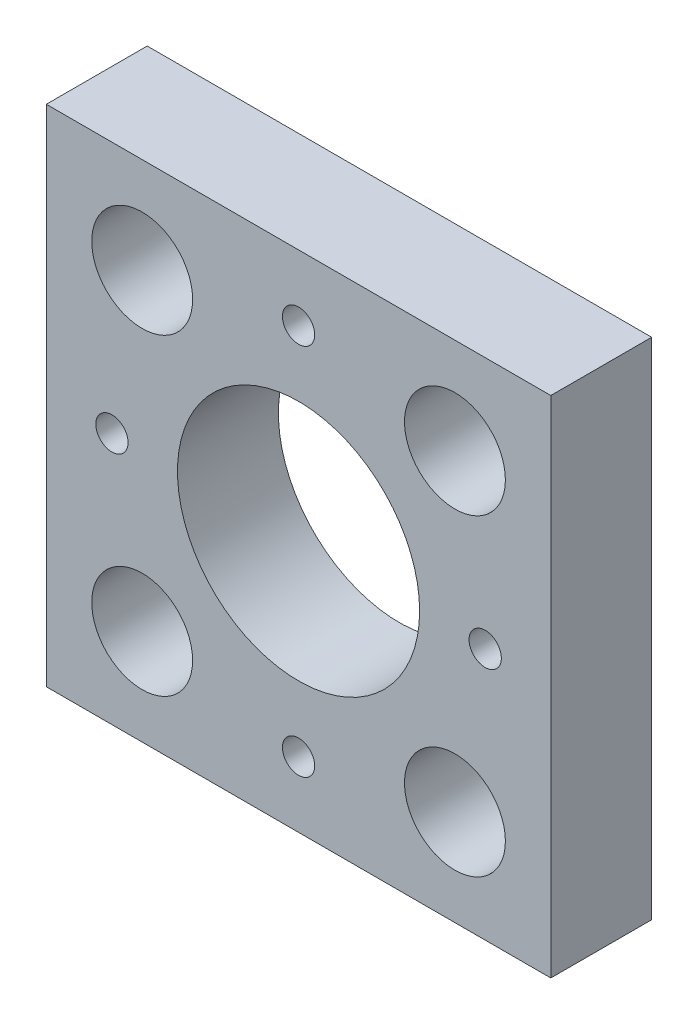
ISO-10303-21;
HEADER;
FILE_DESCRIPTION(('STEP AP214'),'2;1');
FILE_NAME('part.step','',(''),(''),'','','');
FILE_SCHEMA(('AUTOMOTIVE_DESIGN { 1 0 10303 214 1 1 1 1 }'));
ENDSEC;
DATA;
#1=APPLICATION_CONTEXT('core data for automotive mechanical design processes');
#2=APPLICATION_PROTOCOL_DEFINITION('international standard','automotive_design',2000,#1);
#3=PRODUCT_CONTEXT('',#1,'mechanical');
#4=PRODUCT('Part','Part','',(#3));
#5=PRODUCT_RELATED_PRODUCT_CATEGORY('part','',(#4));
#6=PRODUCT_DEFINITION_FORMATION('','',#4);
#7=PRODUCT_DEFINITION_CONTEXT('part definition',#1,'design');
#8=PRODUCT_DEFINITION('design','',#6,#7);
#9=PRODUCT_DEFINITION_SHAPE('','',#8);
#10=(LENGTH_UNIT() NAMED_UNIT(*) SI_UNIT(.MILLI.,.METRE.));
#11=(NAMED_UNIT(*) PLANE_ANGLE_UNIT() SI_UNIT($,.RADIAN.));
#12=(NAMED_UNIT(*) SI_UNIT($,.STERADIAN.) SOLID_ANGLE_UNIT());
#13=UNCERTAINTY_MEASURE_WITH_UNIT(LENGTH_MEASURE(1.E-05),#10,'distance_accuracy_value','');
#14=(GEOMETRIC_REPRESENTATION_CONTEXT(3) GLOBAL_UNCERTAINTY_ASSIGNED_CONTEXT((#13)) GLOBAL_UNIT_ASSIGNED_CONTEXT((#10,
#11,#12)) REPRESENTATION_CONTEXT('',''));
#15=CARTESIAN_POINT('',(0.,0.,0.));
#16=DIRECTION('',(0.,0.,1.));
#17=DIRECTION('',(1.,0.,0.));
#18=AXIS2_PLACEMENT_3D('',#15,#16,#17);
#19=CARTESIAN_POINT('',(25.,-25.,10.));
#20=DIRECTION('',(-1.,0.,0.));
#21=DIRECTION('',(0.,0.,1.));
#22=AXIS2_PLACEMENT_3D('',#19,#20,#21);
#23=PLANE('',#22);
#24=DIRECTION('',(0.,1.,0.));
#25=VECTOR('',#24,1.);
#26=CARTESIAN_POINT('',(25.,-25.,0.));
#27=LINE('',#26,#25);
#28=CARTESIAN_POINT('',(25.,-25.,0.));
#29=VERTEX_POINT('',#28);
#30=CARTESIAN_POINT('',(25.,25.,0.));
#31=VERTEX_POINT('',#30);
#32=EDGE_CURVE('E102',#29,#31,#27,.T.);
#33=ORIENTED_EDGE('',*,*,#32,.T.);
#34=DIRECTION('',(0.,0.,-1.));
#35=VECTOR('',#34,1.);
#36=CARTESIAN_POINT('',(25.,25.,10.));
#37=LINE('',#36,#35);
#38=CARTESIAN_POINT('',(25.,25.,10.));
#39=VERTEX_POINT('',#38);
#40=EDGE_CURVE('E11',#39,#31,#37,.T.);
#41=ORIENTED_EDGE('',*,*,#40,.F.);
#42=DIRECTION('',(0.,1.,0.));
#43=VECTOR('',#42,1.);
#44=CARTESIAN_POINT('',(25.,-25.,10.));
#45=LINE('',#44,#43);
#46=CARTESIAN_POINT('',(25.,-25.,10.));
#47=VERTEX_POINT('',#46);
#48=EDGE_CURVE('E90',#47,#39,#45,.T.);
#49=ORIENTED_EDGE('',*,*,#48,.F.);
#50=DIRECTION('',(0.,0.,-1.));
#51=VECTOR('',#50,1.);
#52=CARTESIAN_POINT('',(25.,-25.,10.));
#53=LINE('',#52,#51);
#54=EDGE_CURVE('E98',#47,#29,#53,.T.);
#55=ORIENTED_EDGE('',*,*,#54,.T.);
#56=EDGE_LOOP('',(#33,#41,#49,#55));
#57=FACE_BOUND('',#56,.T.);
#58=ADVANCED_FACE('F39',(#57),#23,.F.);
#59=CARTESIAN_POINT('',(-25.,25.,10.));
#60=DIRECTION('',(0.,-1.,0.));
#61=DIRECTION('',(0.,0.,-1.));
#62=AXIS2_PLACEMENT_3D('',#59,#60,#61);
#63=PLANE('',#62);
#64=DIRECTION('',(-1.,0.,0.));
#65=VECTOR('',#64,1.);
#66=CARTESIAN_POINT('',(-25.,25.,0.));
#67=LINE('',#66,#65);
#68=CARTESIAN_POINT('',(-25.,25.,0.));
#69=VERTEX_POINT('',#68);
#70=EDGE_CURVE('E94',#31,#69,#67,.T.);
#71=ORIENTED_EDGE('',*,*,#70,.T.);
#72=DIRECTION('',(0.,0.,-1.));
#73=VECTOR('',#72,1.);
#74=CARTESIAN_POINT('',(-25.,25.,10.));
#75=LINE('',#74,#73);
#76=CARTESIAN_POINT('',(-25.,25.,10.));
#77=VERTEX_POINT('',#76);
#78=EDGE_CURVE('E47',#77,#69,#75,.T.);
#79=ORIENTED_EDGE('',*,*,#78,.F.);
#80=DIRECTION('',(-1.,0.,0.));
#81=VECTOR('',#80,1.);
#82=CARTESIAN_POINT('',(-25.,25.,10.));
#83=LINE('',#82,#81);
#84=EDGE_CURVE('E85',#39,#77,#83,.T.);
#85=ORIENTED_EDGE('',*,*,#84,.F.);
#86=ORIENTED_EDGE('',*,*,#40,.T.);
#87=EDGE_LOOP('',(#71,#79,#85,#86));
#88=FACE_BOUND('',#87,.T.);
#89=ADVANCED_FACE('F93',(#88),#63,.F.);
#90=CARTESIAN_POINT('',(-25.,-25.,10.));
#91=DIRECTION('',(1.,0.,0.));
#92=DIRECTION('',(0.,0.,-1.));
#93=AXIS2_PLACEMENT_3D('',#90,#91,#92);
#94=PLANE('',#93);
#95=DIRECTION('',(0.,-1.,0.));
#96=VECTOR('',#95,1.);
#97=CARTESIAN_POINT('',(-25.,-25.,0.));
#98=LINE('',#97,#96);
#99=CARTESIAN_POINT('',(-25.,-25.,0.));
#100=VERTEX_POINT('',#99);
#101=EDGE_CURVE('E72',#69,#100,#98,.T.);
#102=ORIENTED_EDGE('',*,*,#101,.T.);
#103=DIRECTION('',(0.,0.,-1.));
#104=VECTOR('',#103,1.);
#105=CARTESIAN_POINT('',(-25.,-25.,10.));
#106=LINE('',#105,#104);
#107=CARTESIAN_POINT('',(-25.,-25.,10.));
#108=VERTEX_POINT('',#107);
#109=EDGE_CURVE('E95',#108,#100,#106,.T.);
#110=ORIENTED_EDGE('',*,*,#109,.F.);
#111=DIRECTION('',(0.,-1.,0.));
#112=VECTOR('',#111,1.);
#113=CARTESIAN_POINT('',(-25.,-25.,10.));
#114=LINE('',#113,#112);
#115=EDGE_CURVE('E88',#77,#108,#114,.T.);
#116=ORIENTED_EDGE('',*,*,#115,.F.);
#117=ORIENTED_EDGE('',*,*,#78,.T.);
#118=EDGE_LOOP('',(#102,#110,#116,#117));
#119=FACE_BOUND('',#118,.T.);
#120=ADVANCED_FACE('F96',(#119),#94,.F.);
#121=CARTESIAN_POINT('',(-25.,-25.,10.));
#122=DIRECTION('',(0.,1.,0.));
#123=DIRECTION('',(0.,0.,1.));
#124=AXIS2_PLACEMENT_3D('',#121,#122,#123);
#125=PLANE('',#124);
#126=DIRECTION('',(1.,0.,0.));
#127=VECTOR('',#126,1.);
#128=CARTESIAN_POINT('',(-25.,-25.,0.));
#129=LINE('',#128,#127);
#130=EDGE_CURVE('E78',#100,#29,#129,.T.);
#131=ORIENTED_EDGE('',*,*,#130,.T.);
#132=ORIENTED_EDGE('',*,*,#54,.F.);
#133=DIRECTION('',(1.,0.,0.));
#134=VECTOR('',#133,1.);
#135=CARTESIAN_POINT('',(-25.,-25.,10.));
#136=LINE('',#135,#134);
#137=EDGE_CURVE('E55',#108,#47,#136,.T.);
#138=ORIENTED_EDGE('',*,*,#137,.F.);
#139=ORIENTED_EDGE('',*,*,#109,.T.);
#140=EDGE_LOOP('',(#131,#132,#138,#139));
#141=FACE_BOUND('',#140,.T.);
#142=ADVANCED_FACE('F110',(#141),#125,.F.);
#143=CARTESIAN_POINT('',(0.,0.,10.));
#144=DIRECTION('',(0.,0.,-1.));
#145=DIRECTION('',(-1.,0.,0.));
#146=AXIS2_PLACEMENT_3D('',#143,#144,#145);
#147=PLANE('',#146);
#148=CARTESIAN_POINT('',(-15.5,15.5,10.));
#149=DIRECTION('',(0.,0.,1.));
#150=DIRECTION('',(1.,0.,0.));
#151=AXIS2_PLACEMENT_3D('',#148,#149,#150);
#152=CIRCLE('',#151,5.00000000000001);
#153=CARTESIAN_POINT('',(-10.5,15.5,10.));
#154=VERTEX_POINT('',#153);
#155=EDGE_CURVE('E166',#154,#154,#152,.T.);
#156=ORIENTED_EDGE('',*,*,#155,.F.);
#157=EDGE_LOOP('',(#156));
#158=FACE_BOUND('',#157,.T.);
#159=CARTESIAN_POINT('',(15.5,15.5,10.));
#160=DIRECTION('',(0.,0.,1.));
#161=DIRECTION('',(1.,0.,0.));
#162=AXIS2_PLACEMENT_3D('',#159,#160,#161);
#163=CIRCLE('',#162,5.00000000000002);
#164=CARTESIAN_POINT('',(20.5,15.5,10.));
#165=VERTEX_POINT('',#164);
#166=EDGE_CURVE('E160',#165,#165,#163,.T.);
#167=ORIENTED_EDGE('',*,*,#166,.F.);
#168=EDGE_LOOP('',(#167));
#169=FACE_BOUND('',#168,.T.);
#170=CARTESIAN_POINT('',(15.5,-15.5,10.));
#171=DIRECTION('',(0.,0.,1.));
#172=DIRECTION('',(1.,0.,0.));
#173=AXIS2_PLACEMENT_3D('',#170,#171,#172);
#174=CIRCLE('',#173,5.00000000000002);
#175=CARTESIAN_POINT('',(20.5,-15.5,10.));
#176=VERTEX_POINT('',#175);
#177=EDGE_CURVE('E154',#176,#176,#174,.T.);
#178=ORIENTED_EDGE('',*,*,#177,.F.);
#179=EDGE_LOOP('',(#178));
#180=FACE_BOUND('',#179,.T.);
#181=CARTESIAN_POINT('',(-15.5,-15.5,10.));
#182=DIRECTION('',(0.,0.,1.));
#183=DIRECTION('',(1.,0.,0.));
#184=AXIS2_PLACEMENT_3D('',#181,#182,#183);
#185=CIRCLE('',#184,5.00000000000001);
#186=CARTESIAN_POINT('',(-10.5,-15.5,10.));
#187=VERTEX_POINT('',#186);
#188=EDGE_CURVE('E148',#187,#187,#185,.T.);
#189=ORIENTED_EDGE('',*,*,#188,.F.);
#190=EDGE_LOOP('',(#189));
#191=FACE_BOUND('',#190,.T.);
#192=CARTESIAN_POINT('',(0.,18.5,10.));
#193=DIRECTION('',(0.,0.,1.));
#194=DIRECTION('',(1.,0.,0.));
#195=AXIS2_PLACEMENT_3D('',#192,#193,#194);
#196=CIRCLE('',#195,1.60000000000001);
#197=CARTESIAN_POINT('',(1.60000000000002,18.5,10.));
#198=VERTEX_POINT('',#197);
#199=EDGE_CURVE('E142',#198,#198,#196,.T.);
#200=ORIENTED_EDGE('',*,*,#199,.F.);
#201=EDGE_LOOP('',(#200));
#202=FACE_BOUND('',#201,.T.);
#203=CARTESIAN_POINT('',(18.5,0.,10.));
#204=DIRECTION('',(0.,0.,1.));
#205=DIRECTION('',(1.,0.,0.));
#206=AXIS2_PLACEMENT_3D('',#203,#204,#205);
#207=CIRCLE('',#206,1.60000000000001);
#208=CARTESIAN_POINT('',(20.1,0.,10.));
#209=VERTEX_POINT('',#208);
#210=EDGE_CURVE('E136',#209,#209,#207,.T.);
#211=ORIENTED_EDGE('',*,*,#210,.F.);
#212=EDGE_LOOP('',(#211));
#213=FACE_BOUND('',#212,.T.);
#214=CARTESIAN_POINT('',(0.,-18.5,10.));
#215=DIRECTION('',(0.,0.,1.));
#216=DIRECTION('',(1.,0.,0.));
#217=AXIS2_PLACEMENT_3D('',#214,#215,#216);
#218=CIRCLE('',#217,1.60000000000001);
#219=CARTESIAN_POINT('',(1.60000000000002,-18.5,10.));
#220=VERTEX_POINT('',#219);
#221=EDGE_CURVE('E130',#220,#220,#218,.T.);
#222=ORIENTED_EDGE('',*,*,#221,.F.);
#223=EDGE_LOOP('',(#222));
#224=FACE_BOUND('',#223,.T.);
#225=CARTESIAN_POINT('',(-18.5,0.,10.));
#226=DIRECTION('',(0.,0.,1.));
#227=DIRECTION('',(1.,0.,0.));
#228=AXIS2_PLACEMENT_3D('',#225,#226,#227);
#229=CIRCLE('',#228,1.60000000000001);
#230=CARTESIAN_POINT('',(-16.9,0.,10.));
#231=VERTEX_POINT('',#230);
#232=EDGE_CURVE('E124',#231,#231,#229,.T.);
#233=ORIENTED_EDGE('',*,*,#232,.F.);
#234=EDGE_LOOP('',(#233));
#235=FACE_BOUND('',#234,.T.);
#236=CARTESIAN_POINT('',(0.,0.,10.));
#237=DIRECTION('',(0.,0.,1.));
#238=DIRECTION('',(1.,0.,0.));
#239=AXIS2_PLACEMENT_3D('',#236,#237,#238);
#240=CIRCLE('',#239,12.);
#241=CARTESIAN_POINT('',(12.,0.,10.));
#242=VERTEX_POINT('',#241);
#243=EDGE_CURVE('E118',#242,#242,#240,.T.);
#244=ORIENTED_EDGE('',*,*,#243,.F.);
#245=EDGE_LOOP('',(#244));
#246=FACE_BOUND('',#245,.T.);
#247=ORIENTED_EDGE('',*,*,#48,.T.);
#248=ORIENTED_EDGE('',*,*,#84,.T.);
#249=ORIENTED_EDGE('',*,*,#115,.T.);
#250=ORIENTED_EDGE('',*,*,#137,.T.);
#251=EDGE_LOOP('',(#247,#248,#249,#250));
#252=FACE_BOUND('',#251,.T.);
#253=ADVANCED_FACE('F86',(#158,#169,#180,#191,#202,#213,#224,#235,#246,#252),#147,.F.);
#254=CARTESIAN_POINT('',(0.,0.,0.));
#255=DIRECTION('',(0.,0.,-1.));
#256=DIRECTION('',(-1.,0.,0.));
#257=AXIS2_PLACEMENT_3D('',#254,#255,#256);
#258=PLANE('',#257);
#259=CARTESIAN_POINT('',(-15.5,15.5,0.));
#260=DIRECTION('',(0.,0.,1.));
#261=DIRECTION('',(1.,0.,0.));
#262=AXIS2_PLACEMENT_3D('',#259,#260,#261);
#263=CIRCLE('',#262,5.00000000000001);
#264=CARTESIAN_POINT('',(-10.5,15.5,0.));
#265=VERTEX_POINT('',#264);
#266=EDGE_CURVE('E163',#265,#265,#263,.T.);
#267=ORIENTED_EDGE('',*,*,#266,.T.);
#268=EDGE_LOOP('',(#267));
#269=FACE_BOUND('',#268,.T.);
#270=CARTESIAN_POINT('',(15.5,15.5,0.));
#271=DIRECTION('',(0.,0.,1.));
#272=DIRECTION('',(1.,0.,0.));
#273=AXIS2_PLACEMENT_3D('',#270,#271,#272);
#274=CIRCLE('',#273,5.00000000000002);
#275=CARTESIAN_POINT('',(20.5,15.5,0.));
#276=VERTEX_POINT('',#275);
#277=EDGE_CURVE('E157',#276,#276,#274,.T.);
#278=ORIENTED_EDGE('',*,*,#277,.T.);
#279=EDGE_LOOP('',(#278));
#280=FACE_BOUND('',#279,.T.);
#281=CARTESIAN_POINT('',(15.5,-15.5,0.));
#282=DIRECTION('',(0.,0.,1.));
#283=DIRECTION('',(1.,0.,0.));
#284=AXIS2_PLACEMENT_3D('',#281,#282,#283);
#285=CIRCLE('',#284,5.00000000000002);
#286=CARTESIAN_POINT('',(20.5,-15.5,0.));
#287=VERTEX_POINT('',#286);
#288=EDGE_CURVE('E151',#287,#287,#285,.T.);
#289=ORIENTED_EDGE('',*,*,#288,.T.);
#290=EDGE_LOOP('',(#289));
#291=FACE_BOUND('',#290,.T.);
#292=CARTESIAN_POINT('',(-15.5,-15.5,0.));
#293=DIRECTION('',(0.,0.,1.));
#294=DIRECTION('',(1.,0.,0.));
#295=AXIS2_PLACEMENT_3D('',#292,#293,#294);
#296=CIRCLE('',#295,5.00000000000001);
#297=CARTESIAN_POINT('',(-10.5,-15.5,0.));
#298=VERTEX_POINT('',#297);
#299=EDGE_CURVE('E145',#298,#298,#296,.T.);
#300=ORIENTED_EDGE('',*,*,#299,.T.);
#301=EDGE_LOOP('',(#300));
#302=FACE_BOUND('',#301,.T.);
#303=CARTESIAN_POINT('',(0.,18.5,0.));
#304=DIRECTION('',(0.,0.,1.));
#305=DIRECTION('',(1.,0.,0.));
#306=AXIS2_PLACEMENT_3D('',#303,#304,#305);
#307=CIRCLE('',#306,1.60000000000001);
#308=CARTESIAN_POINT('',(1.60000000000002,18.5,0.));
#309=VERTEX_POINT('',#308);
#310=EDGE_CURVE('E139',#309,#309,#307,.T.);
#311=ORIENTED_EDGE('',*,*,#310,.T.);
#312=EDGE_LOOP('',(#311));
#313=FACE_BOUND('',#312,.T.);
#314=CARTESIAN_POINT('',(18.5,0.,0.));
#315=DIRECTION('',(0.,0.,1.));
#316=DIRECTION('',(1.,0.,0.));
#317=AXIS2_PLACEMENT_3D('',#314,#315,#316);
#318=CIRCLE('',#317,1.60000000000001);
#319=CARTESIAN_POINT('',(20.1,0.,0.));
#320=VERTEX_POINT('',#319);
#321=EDGE_CURVE('E133',#320,#320,#318,.T.);
#322=ORIENTED_EDGE('',*,*,#321,.T.);
#323=EDGE_LOOP('',(#322));
#324=FACE_BOUND('',#323,.T.);
#325=CARTESIAN_POINT('',(0.,-18.5,0.));
#326=DIRECTION('',(0.,0.,1.));
#327=DIRECTION('',(1.,0.,0.));
#328=AXIS2_PLACEMENT_3D('',#325,#326,#327);
#329=CIRCLE('',#328,1.60000000000001);
#330=CARTESIAN_POINT('',(1.60000000000002,-18.5,0.));
#331=VERTEX_POINT('',#330);
#332=EDGE_CURVE('E127',#331,#331,#329,.T.);
#333=ORIENTED_EDGE('',*,*,#332,.T.);
#334=EDGE_LOOP('',(#333));
#335=FACE_BOUND('',#334,.T.);
#336=CARTESIAN_POINT('',(-18.5,0.,0.));
#337=DIRECTION('',(0.,0.,1.));
#338=DIRECTION('',(1.,0.,0.));
#339=AXIS2_PLACEMENT_3D('',#336,#337,#338);
#340=CIRCLE('',#339,1.60000000000001);
#341=CARTESIAN_POINT('',(-16.9,0.,0.));
#342=VERTEX_POINT('',#341);
#343=EDGE_CURVE('E121',#342,#342,#340,.T.);
#344=ORIENTED_EDGE('',*,*,#343,.T.);
#345=EDGE_LOOP('',(#344));
#346=FACE_BOUND('',#345,.T.);
#347=CARTESIAN_POINT('',(0.,0.,0.));
#348=DIRECTION('',(0.,0.,1.));
#349=DIRECTION('',(1.,0.,0.));
#350=AXIS2_PLACEMENT_3D('',#347,#348,#349);
#351=CIRCLE('',#350,12.);
#352=CARTESIAN_POINT('',(12.,0.,0.));
#353=VERTEX_POINT('',#352);
#354=EDGE_CURVE('E105',#353,#353,#351,.T.);
#355=ORIENTED_EDGE('',*,*,#354,.T.);
#356=EDGE_LOOP('',(#355));
#357=FACE_BOUND('',#356,.T.);
#358=ORIENTED_EDGE('',*,*,#32,.F.);
#359=ORIENTED_EDGE('',*,*,#130,.F.);
#360=ORIENTED_EDGE('',*,*,#101,.F.);
#361=ORIENTED_EDGE('',*,*,#70,.F.);
#362=EDGE_LOOP('',(#358,#359,#360,#361));
#363=FACE_BOUND('',#362,.T.);
#364=ADVANCED_FACE('F113',(#269,#280,#291,#302,#313,#324,#335,#346,#357,#363),#258,.T.);
#365=CARTESIAN_POINT('',(0.,0.,10.));
#366=DIRECTION('',(0.,0.,1.));
#367=DIRECTION('',(1.,0.,0.));
#368=AXIS2_PLACEMENT_3D('',#365,#366,#367);
#369=CYLINDRICAL_SURFACE('',#368,12.);
#370=ORIENTED_EDGE('',*,*,#354,.F.);
#371=EDGE_LOOP('',(#370));
#372=FACE_BOUND('',#371,.T.);
#373=ORIENTED_EDGE('',*,*,#243,.T.);
#374=EDGE_LOOP('',(#373));
#375=FACE_BOUND('',#374,.T.);
#376=ADVANCED_FACE('F191',(#372,#375),#369,.F.);
#377=CARTESIAN_POINT('',(-18.5,0.,10.));
#378=DIRECTION('',(0.,0.,1.));
#379=DIRECTION('',(1.,0.,0.));
#380=AXIS2_PLACEMENT_3D('',#377,#378,#379);
#381=CYLINDRICAL_SURFACE('',#380,1.60000000000001);
#382=ORIENTED_EDGE('',*,*,#343,.F.);
#383=EDGE_LOOP('',(#382));
#384=FACE_BOUND('',#383,.T.);
#385=ORIENTED_EDGE('',*,*,#232,.T.);
#386=EDGE_LOOP('',(#385));
#387=FACE_BOUND('',#386,.T.);
#388=ADVANCED_FACE('F193',(#384,#387),#381,.F.);
#389=CARTESIAN_POINT('',(0.,-18.5,10.));
#390=DIRECTION('',(0.,0.,1.));
#391=DIRECTION('',(1.,0.,0.));
#392=AXIS2_PLACEMENT_3D('',#389,#390,#391);
#393=CYLINDRICAL_SURFACE('',#392,1.60000000000001);
#394=ORIENTED_EDGE('',*,*,#332,.F.);
#395=EDGE_LOOP('',(#394));
#396=FACE_BOUND('',#395,.T.);
#397=ORIENTED_EDGE('',*,*,#221,.T.);
#398=EDGE_LOOP('',(#397));
#399=FACE_BOUND('',#398,.T.);
#400=ADVANCED_FACE('F200',(#396,#399),#393,.F.);
#401=CARTESIAN_POINT('',(18.5,0.,10.));
#402=DIRECTION('',(0.,0.,1.));
#403=DIRECTION('',(1.,0.,0.));
#404=AXIS2_PLACEMENT_3D('',#401,#402,#403);
#405=CYLINDRICAL_SURFACE('',#404,1.60000000000001);
#406=ORIENTED_EDGE('',*,*,#321,.F.);
#407=EDGE_LOOP('',(#406));
#408=FACE_BOUND('',#407,.T.);
#409=ORIENTED_EDGE('',*,*,#210,.T.);
#410=EDGE_LOOP('',(#409));
#411=FACE_BOUND('',#410,.T.);
#412=ADVANCED_FACE('F281',(#408,#411),#405,.F.);
#413=CARTESIAN_POINT('',(0.,18.5,10.));
#414=DIRECTION('',(0.,0.,1.));
#415=DIRECTION('',(1.,0.,0.));
#416=AXIS2_PLACEMENT_3D('',#413,#414,#415);
#417=CYLINDRICAL_SURFACE('',#416,1.60000000000001);
#418=ORIENTED_EDGE('',*,*,#310,.F.);
#419=EDGE_LOOP('',(#418));
#420=FACE_BOUND('',#419,.T.);
#421=ORIENTED_EDGE('',*,*,#199,.T.);
#422=EDGE_LOOP('',(#421));
#423=FACE_BOUND('',#422,.T.);
#424=ADVANCED_FACE('F243',(#420,#423),#417,.F.);
#425=CARTESIAN_POINT('',(-15.5,-15.5,10.));
#426=DIRECTION('',(0.,0.,1.));
#427=DIRECTION('',(1.,0.,0.));
#428=AXIS2_PLACEMENT_3D('',#425,#426,#427);
#429=CYLINDRICAL_SURFACE('',#428,5.00000000000001);
#430=ORIENTED_EDGE('',*,*,#299,.F.);
#431=EDGE_LOOP('',(#430));
#432=FACE_BOUND('',#431,.T.);
#433=ORIENTED_EDGE('',*,*,#188,.T.);
#434=EDGE_LOOP('',(#433));
#435=FACE_BOUND('',#434,.T.);
#436=ADVANCED_FACE('F237',(#432,#435),#429,.F.);
#437=CARTESIAN_POINT('',(15.5,-15.5,10.));
#438=DIRECTION('',(0.,0.,1.));
#439=DIRECTION('',(1.,0.,0.));
#440=AXIS2_PLACEMENT_3D('',#437,#438,#439);
#441=CYLINDRICAL_SURFACE('',#440,5.00000000000002);
#442=ORIENTED_EDGE('',*,*,#288,.F.);
#443=EDGE_LOOP('',(#442));
#444=FACE_BOUND('',#443,.T.);
#445=ORIENTED_EDGE('',*,*,#177,.T.);
#446=EDGE_LOOP('',(#445));
#447=FACE_BOUND('',#446,.T.);
#448=ADVANCED_FACE('F242',(#444,#447),#441,.F.);
#449=CARTESIAN_POINT('',(15.5,15.5,10.));
#450=DIRECTION('',(0.,0.,1.));
#451=DIRECTION('',(1.,0.,0.));
#452=AXIS2_PLACEMENT_3D('',#449,#450,#451);
#453=CYLINDRICAL_SURFACE('',#452,5.00000000000002);
#454=ORIENTED_EDGE('',*,*,#277,.F.);
#455=EDGE_LOOP('',(#454));
#456=FACE_BOUND('',#455,.T.);
#457=ORIENTED_EDGE('',*,*,#166,.T.);
#458=EDGE_LOOP('',(#457));
#459=FACE_BOUND('',#458,.T.);
#460=ADVANCED_FACE('F255',(#456,#459),#453,.F.);
#461=CARTESIAN_POINT('',(-15.5,15.5,10.));
#462=DIRECTION('',(0.,0.,1.));
#463=DIRECTION('',(1.,0.,0.));
#464=AXIS2_PLACEMENT_3D('',#461,#462,#463);
#465=CYLINDRICAL_SURFACE('',#464,5.00000000000001);
#466=ORIENTED_EDGE('',*,*,#266,.F.);
#467=EDGE_LOOP('',(#466));
#468=FACE_BOUND('',#467,.T.);
#469=ORIENTED_EDGE('',*,*,#155,.T.);
#470=EDGE_LOOP('',(#469));
#471=FACE_BOUND('',#470,.T.);
#472=ADVANCED_FACE('F170',(#468,#471),#465,.F.);
#473=CLOSED_SHELL('',(#58,#89,#120,#142,#253,#364,#376,#388,#400,#412,#424,#436,#448,#460,#472));
#474=MANIFOLD_SOLID_BREP('B2',#473);
#475=ADVANCED_BREP_SHAPE_REPRESENTATION('',(#18,#474),#14);
#476=SHAPE_DEFINITION_REPRESENTATION(#9,#475);
ENDSEC;
END-ISO-10303-21;
